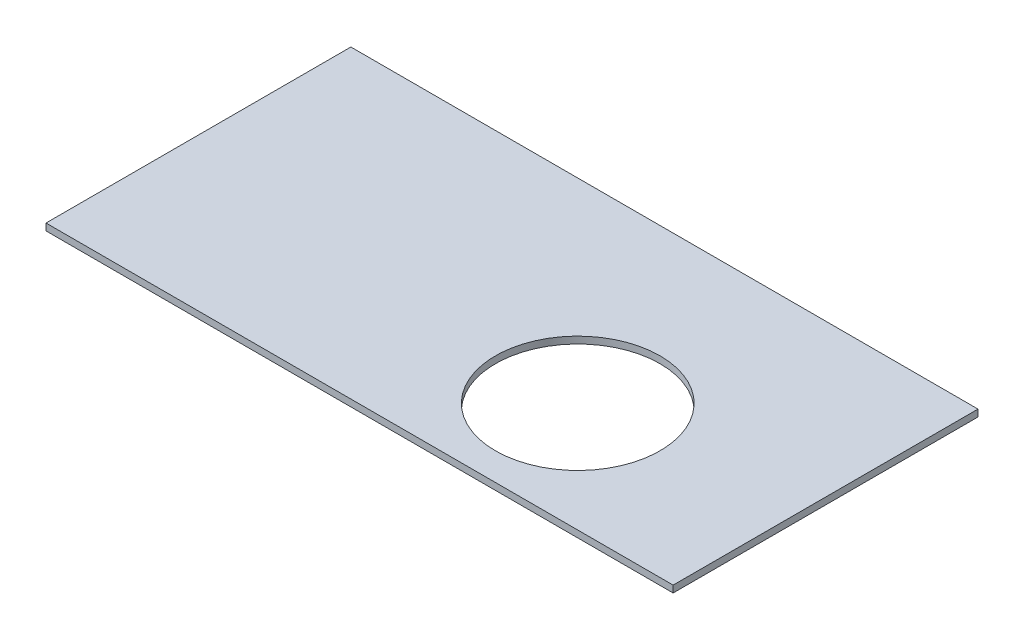
ISO-10303-21;
HEADER;
FILE_DESCRIPTION(('STEP AP214'),'2;1');
FILE_NAME('part.step','',(''),(''),'','','');
FILE_SCHEMA(('AUTOMOTIVE_DESIGN { 1 0 10303 214 1 1 1 1 }'));
ENDSEC;
DATA;
#1=APPLICATION_CONTEXT('core data for automotive mechanical design processes');
#2=APPLICATION_PROTOCOL_DEFINITION('international standard','automotive_design',2000,#1);
#3=PRODUCT_CONTEXT('',#1,'mechanical');
#4=PRODUCT('Part','Part','',(#3));
#5=PRODUCT_RELATED_PRODUCT_CATEGORY('part','',(#4));
#6=PRODUCT_DEFINITION_FORMATION('','',#4);
#7=PRODUCT_DEFINITION_CONTEXT('part definition',#1,'design');
#8=PRODUCT_DEFINITION('design','',#6,#7);
#9=PRODUCT_DEFINITION_SHAPE('','',#8);
#10=(LENGTH_UNIT() NAMED_UNIT(*) SI_UNIT(.MILLI.,.METRE.));
#11=(NAMED_UNIT(*) PLANE_ANGLE_UNIT() SI_UNIT($,.RADIAN.));
#12=(NAMED_UNIT(*) SI_UNIT($,.STERADIAN.) SOLID_ANGLE_UNIT());
#13=UNCERTAINTY_MEASURE_WITH_UNIT(LENGTH_MEASURE(1.E-05),#10,'distance_accuracy_value','');
#14=(GEOMETRIC_REPRESENTATION_CONTEXT(3) GLOBAL_UNCERTAINTY_ASSIGNED_CONTEXT((#13)) GLOBAL_UNIT_ASSIGNED_CONTEXT((#10,
#11,#12)) REPRESENTATION_CONTEXT('',''));
#15=CARTESIAN_POINT('',(0.,0.,0.));
#16=DIRECTION('',(0.,0.,1.));
#17=DIRECTION('',(1.,0.,0.));
#18=AXIS2_PLACEMENT_3D('',#15,#16,#17);
#19=CARTESIAN_POINT('',(-228.6,5.,111.125));
#20=DIRECTION('',(1.,0.,0.));
#21=DIRECTION('',(0.,0.,-1.));
#22=AXIS2_PLACEMENT_3D('',#19,#20,#21);
#23=PLANE('',#22);
#24=DIRECTION('',(0.,0.,1.));
#25=VECTOR('',#24,1.);
#26=CARTESIAN_POINT('',(-228.6,0.,111.125));
#27=LINE('',#26,#25);
#28=CARTESIAN_POINT('',(-228.6,0.,-111.125));
#29=VERTEX_POINT('',#28);
#30=CARTESIAN_POINT('',(-228.6,0.,111.125));
#31=VERTEX_POINT('',#30);
#32=EDGE_CURVE('E96',#29,#31,#27,.T.);
#33=ORIENTED_EDGE('',*,*,#32,.T.);
#34=DIRECTION('',(0.,-1.,0.));
#35=VECTOR('',#34,1.);
#36=CARTESIAN_POINT('',(-228.6,5.,111.125));
#37=LINE('',#36,#35);
#38=CARTESIAN_POINT('',(-228.6,5.,111.125));
#39=VERTEX_POINT('',#38);
#40=EDGE_CURVE('E11',#39,#31,#37,.T.);
#41=ORIENTED_EDGE('',*,*,#40,.F.);
#42=DIRECTION('',(0.,0.,1.));
#43=VECTOR('',#42,1.);
#44=CARTESIAN_POINT('',(-228.6,5.,111.125));
#45=LINE('',#44,#43);
#46=CARTESIAN_POINT('',(-228.6,5.,-111.125));
#47=VERTEX_POINT('',#46);
#48=EDGE_CURVE('E84',#47,#39,#45,.T.);
#49=ORIENTED_EDGE('',*,*,#48,.F.);
#50=DIRECTION('',(0.,-1.,0.));
#51=VECTOR('',#50,1.);
#52=CARTESIAN_POINT('',(-228.6,5.,-111.125));
#53=LINE('',#52,#51);
#54=EDGE_CURVE('E92',#47,#29,#53,.T.);
#55=ORIENTED_EDGE('',*,*,#54,.T.);
#56=EDGE_LOOP('',(#33,#41,#49,#55));
#57=FACE_BOUND('',#56,.T.);
#58=ADVANCED_FACE('F33',(#57),#23,.F.);
#59=CARTESIAN_POINT('',(228.6,5.,111.125));
#60=DIRECTION('',(0.,0.,-1.));
#61=DIRECTION('',(-1.,0.,0.));
#62=AXIS2_PLACEMENT_3D('',#59,#60,#61);
#63=PLANE('',#62);
#64=DIRECTION('',(1.,0.,0.));
#65=VECTOR('',#64,1.);
#66=CARTESIAN_POINT('',(228.6,0.,111.125));
#67=LINE('',#66,#65);
#68=CARTESIAN_POINT('',(228.6,0.,111.125));
#69=VERTEX_POINT('',#68);
#70=EDGE_CURVE('E88',#31,#69,#67,.T.);
#71=ORIENTED_EDGE('',*,*,#70,.T.);
#72=DIRECTION('',(0.,-1.,0.));
#73=VECTOR('',#72,1.);
#74=CARTESIAN_POINT('',(228.6,5.,111.125));
#75=LINE('',#74,#73);
#76=CARTESIAN_POINT('',(228.6,5.,111.125));
#77=VERTEX_POINT('',#76);
#78=EDGE_CURVE('E41',#77,#69,#75,.T.);
#79=ORIENTED_EDGE('',*,*,#78,.F.);
#80=DIRECTION('',(1.,0.,0.));
#81=VECTOR('',#80,1.);
#82=CARTESIAN_POINT('',(228.6,5.,111.125));
#83=LINE('',#82,#81);
#84=EDGE_CURVE('E79',#39,#77,#83,.T.);
#85=ORIENTED_EDGE('',*,*,#84,.F.);
#86=ORIENTED_EDGE('',*,*,#40,.T.);
#87=EDGE_LOOP('',(#71,#79,#85,#86));
#88=FACE_BOUND('',#87,.T.);
#89=ADVANCED_FACE('F87',(#88),#63,.F.);
#90=CARTESIAN_POINT('',(228.6,5.,111.125));
#91=DIRECTION('',(-1.,0.,0.));
#92=DIRECTION('',(0.,0.,1.));
#93=AXIS2_PLACEMENT_3D('',#90,#91,#92);
#94=PLANE('',#93);
#95=DIRECTION('',(0.,0.,-1.));
#96=VECTOR('',#95,1.);
#97=CARTESIAN_POINT('',(228.6,0.,111.125));
#98=LINE('',#97,#96);
#99=CARTESIAN_POINT('',(228.6,0.,-111.125));
#100=VERTEX_POINT('',#99);
#101=EDGE_CURVE('E66',#69,#100,#98,.T.);
#102=ORIENTED_EDGE('',*,*,#101,.T.);
#103=DIRECTION('',(0.,-1.,0.));
#104=VECTOR('',#103,1.);
#105=CARTESIAN_POINT('',(228.6,5.,-111.125));
#106=LINE('',#105,#104);
#107=CARTESIAN_POINT('',(228.6,5.,-111.125));
#108=VERTEX_POINT('',#107);
#109=EDGE_CURVE('E89',#108,#100,#106,.T.);
#110=ORIENTED_EDGE('',*,*,#109,.F.);
#111=DIRECTION('',(0.,0.,-1.));
#112=VECTOR('',#111,1.);
#113=CARTESIAN_POINT('',(228.6,5.,111.125));
#114=LINE('',#113,#112);
#115=EDGE_CURVE('E82',#77,#108,#114,.T.);
#116=ORIENTED_EDGE('',*,*,#115,.F.);
#117=ORIENTED_EDGE('',*,*,#78,.T.);
#118=EDGE_LOOP('',(#102,#110,#116,#117));
#119=FACE_BOUND('',#118,.T.);
#120=ADVANCED_FACE('F90',(#119),#94,.F.);
#121=CARTESIAN_POINT('',(228.6,5.,-111.125));
#122=DIRECTION('',(0.,0.,1.));
#123=DIRECTION('',(1.,0.,0.));
#124=AXIS2_PLACEMENT_3D('',#121,#122,#123);
#125=PLANE('',#124);
#126=DIRECTION('',(-1.,0.,0.));
#127=VECTOR('',#126,1.);
#128=CARTESIAN_POINT('',(228.6,0.,-111.125));
#129=LINE('',#128,#127);
#130=EDGE_CURVE('E72',#100,#29,#129,.T.);
#131=ORIENTED_EDGE('',*,*,#130,.T.);
#132=ORIENTED_EDGE('',*,*,#54,.F.);
#133=DIRECTION('',(-1.,0.,0.));
#134=VECTOR('',#133,1.);
#135=CARTESIAN_POINT('',(228.6,5.,-111.125));
#136=LINE('',#135,#134);
#137=EDGE_CURVE('E49',#108,#47,#136,.T.);
#138=ORIENTED_EDGE('',*,*,#137,.F.);
#139=ORIENTED_EDGE('',*,*,#109,.T.);
#140=EDGE_LOOP('',(#131,#132,#138,#139));
#141=FACE_BOUND('',#140,.T.);
#142=ADVANCED_FACE('F104',(#141),#125,.F.);
#143=CARTESIAN_POINT('',(0.,5.,0.));
#144=DIRECTION('',(0.,1.,0.));
#145=DIRECTION('',(0.,0.,1.));
#146=AXIS2_PLACEMENT_3D('',#143,#144,#145);
#147=PLANE('',#146);
#148=CARTESIAN_POINT('',(79.05,5.,31.125));
#149=DIRECTION('',(0.,1.,0.));
#150=DIRECTION('',(0.,0.,1.));
#151=AXIS2_PLACEMENT_3D('',#148,#149,#150);
#152=CIRCLE('',#151,60.);
#153=CARTESIAN_POINT('',(79.05,5.,91.125));
#154=VERTEX_POINT('',#153);
#155=EDGE_CURVE('E110',#154,#154,#152,.T.);
#156=ORIENTED_EDGE('',*,*,#155,.F.);
#157=EDGE_LOOP('',(#156));
#158=FACE_BOUND('',#157,.T.);
#159=ORIENTED_EDGE('',*,*,#48,.T.);
#160=ORIENTED_EDGE('',*,*,#84,.T.);
#161=ORIENTED_EDGE('',*,*,#115,.T.);
#162=ORIENTED_EDGE('',*,*,#137,.T.);
#163=EDGE_LOOP('',(#159,#160,#161,#162));
#164=FACE_BOUND('',#163,.T.);
#165=ADVANCED_FACE('F80',(#158,#164),#147,.T.);
#166=CARTESIAN_POINT('',(0.,0.,0.));
#167=DIRECTION('',(0.,1.,0.));
#168=DIRECTION('',(0.,0.,1.));
#169=AXIS2_PLACEMENT_3D('',#166,#167,#168);
#170=PLANE('',#169);
#171=CARTESIAN_POINT('',(79.05,0.,31.125));
#172=DIRECTION('',(0.,1.,0.));
#173=DIRECTION('',(0.,0.,1.));
#174=AXIS2_PLACEMENT_3D('',#171,#172,#173);
#175=CIRCLE('',#174,60.);
#176=CARTESIAN_POINT('',(79.05,0.,91.125));
#177=VERTEX_POINT('',#176);
#178=EDGE_CURVE('E99',#177,#177,#175,.T.);
#179=ORIENTED_EDGE('',*,*,#178,.T.);
#180=EDGE_LOOP('',(#179));
#181=FACE_BOUND('',#180,.T.);
#182=ORIENTED_EDGE('',*,*,#32,.F.);
#183=ORIENTED_EDGE('',*,*,#130,.F.);
#184=ORIENTED_EDGE('',*,*,#101,.F.);
#185=ORIENTED_EDGE('',*,*,#70,.F.);
#186=EDGE_LOOP('',(#182,#183,#184,#185));
#187=FACE_BOUND('',#186,.T.);
#188=ADVANCED_FACE('F107',(#181,#187),#170,.F.);
#189=CARTESIAN_POINT('',(79.05,0.,31.125));
#190=DIRECTION('',(0.,1.,0.));
#191=DIRECTION('',(0.,0.,1.));
#192=AXIS2_PLACEMENT_3D('',#189,#190,#191);
#193=CYLINDRICAL_SURFACE('',#192,60.);
#194=ORIENTED_EDGE('',*,*,#178,.F.);
#195=EDGE_LOOP('',(#194));
#196=FACE_BOUND('',#195,.T.);
#197=ORIENTED_EDGE('',*,*,#155,.T.);
#198=EDGE_LOOP('',(#197));
#199=FACE_BOUND('',#198,.T.);
#200=ADVANCED_FACE('F117',(#196,#199),#193,.F.);
#201=CLOSED_SHELL('',(#58,#89,#120,#142,#165,#188,#200));
#202=MANIFOLD_SOLID_BREP('B2',#201);
#203=ADVANCED_BREP_SHAPE_REPRESENTATION('',(#18,#202),#14);
#204=SHAPE_DEFINITION_REPRESENTATION(#9,#203);
ENDSEC;
END-ISO-10303-21;
